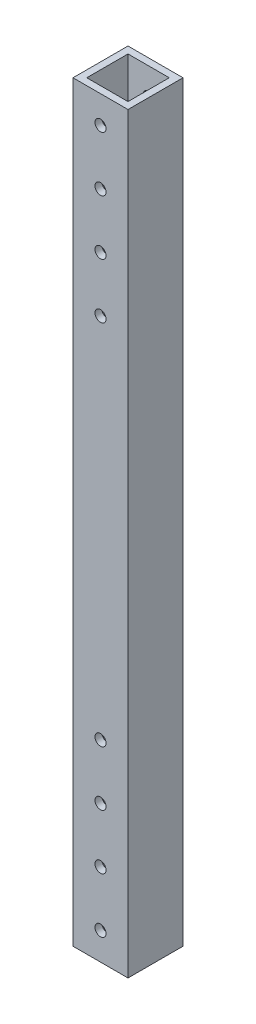
ISO-10303-21;
HEADER;
FILE_DESCRIPTION(('STEP AP214'),'2;1');
FILE_NAME('part.step','',(''),(''),'','','');
FILE_SCHEMA(('AUTOMOTIVE_DESIGN { 1 0 10303 214 1 1 1 1 }'));
ENDSEC;
DATA;
#1=APPLICATION_CONTEXT('core data for automotive mechanical design processes');
#2=APPLICATION_PROTOCOL_DEFINITION('international standard','automotive_design',2000,#1);
#3=PRODUCT_CONTEXT('',#1,'mechanical');
#4=PRODUCT('Part','Part','',(#3));
#5=PRODUCT_RELATED_PRODUCT_CATEGORY('part','',(#4));
#6=PRODUCT_DEFINITION_FORMATION('','',#4);
#7=PRODUCT_DEFINITION_CONTEXT('part definition',#1,'design');
#8=PRODUCT_DEFINITION('design','',#6,#7);
#9=PRODUCT_DEFINITION_SHAPE('','',#8);
#10=(LENGTH_UNIT() NAMED_UNIT(*) SI_UNIT(.MILLI.,.METRE.));
#11=(NAMED_UNIT(*) PLANE_ANGLE_UNIT() SI_UNIT($,.RADIAN.));
#12=(NAMED_UNIT(*) SI_UNIT($,.STERADIAN.) SOLID_ANGLE_UNIT());
#13=UNCERTAINTY_MEASURE_WITH_UNIT(LENGTH_MEASURE(1.E-05),#10,'distance_accuracy_value','');
#14=(GEOMETRIC_REPRESENTATION_CONTEXT(3) GLOBAL_UNCERTAINTY_ASSIGNED_CONTEXT((#13)) GLOBAL_UNIT_ASSIGNED_CONTEXT((#10,
#11,#12)) REPRESENTATION_CONTEXT('',''));
#15=CARTESIAN_POINT('',(0.,0.,0.));
#16=DIRECTION('',(0.,0.,1.));
#17=DIRECTION('',(1.,0.,0.));
#18=AXIS2_PLACEMENT_3D('',#15,#16,#17);
#19=CARTESIAN_POINT('',(-12.7,347.345,-12.7));
#20=DIRECTION('',(0.,0.,1.));
#21=DIRECTION('',(1.,0.,0.));
#22=AXIS2_PLACEMENT_3D('',#19,#20,#21);
#23=PLANE('',#22);
#24=CARTESIAN_POINT('',(0.,12.7,-12.7));
#25=DIRECTION('',(0.,0.,1.));
#26=DIRECTION('',(1.,0.,0.));
#27=AXIS2_PLACEMENT_3D('',#24,#25,#26);
#28=CIRCLE('',#27,2.5527);
#29=CARTESIAN_POINT('',(2.55270000000001,12.7,-12.7));
#30=VERTEX_POINT('',#29);
#31=EDGE_CURVE('E187',#30,#30,#28,.T.);
#32=ORIENTED_EDGE('',*,*,#31,.T.);
#33=EDGE_LOOP('',(#32));
#34=FACE_BOUND('',#33,.T.);
#35=CARTESIAN_POINT('',(0.,38.1,-12.7));
#36=DIRECTION('',(0.,0.,1.));
#37=DIRECTION('',(1.,0.,0.));
#38=AXIS2_PLACEMENT_3D('',#35,#36,#37);
#39=CIRCLE('',#38,2.5527);
#40=CARTESIAN_POINT('',(2.55270000000001,38.1,-12.7));
#41=VERTEX_POINT('',#40);
#42=EDGE_CURVE('E183',#41,#41,#39,.T.);
#43=ORIENTED_EDGE('',*,*,#42,.T.);
#44=EDGE_LOOP('',(#43));
#45=FACE_BOUND('',#44,.T.);
#46=CARTESIAN_POINT('',(0.,63.5,-12.7));
#47=DIRECTION('',(0.,0.,1.));
#48=DIRECTION('',(1.,0.,0.));
#49=AXIS2_PLACEMENT_3D('',#46,#47,#48);
#50=CIRCLE('',#49,2.5527);
#51=CARTESIAN_POINT('',(2.55270000000001,63.5,-12.7));
#52=VERTEX_POINT('',#51);
#53=EDGE_CURVE('E178',#52,#52,#50,.T.);
#54=ORIENTED_EDGE('',*,*,#53,.T.);
#55=EDGE_LOOP('',(#54));
#56=FACE_BOUND('',#55,.T.);
#57=CARTESIAN_POINT('',(0.,334.645,-12.7));
#58=DIRECTION('',(0.,0.,1.));
#59=DIRECTION('',(1.,0.,0.));
#60=AXIS2_PLACEMENT_3D('',#57,#58,#59);
#61=CIRCLE('',#60,2.5527);
#62=CARTESIAN_POINT('',(2.55270000000001,334.645,-12.7));
#63=VERTEX_POINT('',#62);
#64=EDGE_CURVE('E173',#63,#63,#61,.T.);
#65=ORIENTED_EDGE('',*,*,#64,.T.);
#66=EDGE_LOOP('',(#65));
#67=FACE_BOUND('',#66,.T.);
#68=CARTESIAN_POINT('',(0.,309.245,-12.7));
#69=DIRECTION('',(0.,0.,1.));
#70=DIRECTION('',(1.,0.,0.));
#71=AXIS2_PLACEMENT_3D('',#68,#69,#70);
#72=CIRCLE('',#71,2.5527);
#73=CARTESIAN_POINT('',(2.55270000000001,309.245,-12.7));
#74=VERTEX_POINT('',#73);
#75=EDGE_CURVE('E168',#74,#74,#72,.T.);
#76=ORIENTED_EDGE('',*,*,#75,.T.);
#77=EDGE_LOOP('',(#76));
#78=FACE_BOUND('',#77,.T.);
#79=CARTESIAN_POINT('',(0.,283.845,-12.7));
#80=DIRECTION('',(0.,0.,1.));
#81=DIRECTION('',(1.,0.,0.));
#82=AXIS2_PLACEMENT_3D('',#79,#80,#81);
#83=CIRCLE('',#82,2.5527);
#84=CARTESIAN_POINT('',(2.55270000000001,283.845,-12.7));
#85=VERTEX_POINT('',#84);
#86=EDGE_CURVE('E247',#85,#85,#83,.T.);
#87=ORIENTED_EDGE('',*,*,#86,.T.);
#88=EDGE_LOOP('',(#87));
#89=FACE_BOUND('',#88,.T.);
#90=DIRECTION('',(-1.,0.,0.));
#91=VECTOR('',#90,1.);
#92=CARTESIAN_POINT('',(-12.7,0.,-12.7));
#93=LINE('',#92,#91);
#94=CARTESIAN_POINT('',(12.7,0.,-12.7));
#95=VERTEX_POINT('',#94);
#96=CARTESIAN_POINT('',(-12.7,0.,-12.7));
#97=VERTEX_POINT('',#96);
#98=EDGE_CURVE('E152',#95,#97,#93,.T.);
#99=ORIENTED_EDGE('',*,*,#98,.T.);
#100=DIRECTION('',(0.,-1.,0.));
#101=VECTOR('',#100,1.);
#102=CARTESIAN_POINT('',(-12.7,347.345,-12.7));
#103=LINE('',#102,#101);
#104=CARTESIAN_POINT('',(-12.7,347.345,-12.7));
#105=VERTEX_POINT('',#104);
#106=EDGE_CURVE('E42',#105,#97,#103,.T.);
#107=ORIENTED_EDGE('',*,*,#106,.F.);
#108=DIRECTION('',(-1.,0.,0.));
#109=VECTOR('',#108,1.);
#110=CARTESIAN_POINT('',(-12.7,347.345,-12.7));
#111=LINE('',#110,#109);
#112=CARTESIAN_POINT('',(12.7,347.345,-12.7));
#113=VERTEX_POINT('',#112);
#114=EDGE_CURVE('E142',#113,#105,#111,.T.);
#115=ORIENTED_EDGE('',*,*,#114,.F.);
#116=DIRECTION('',(0.,-1.,0.));
#117=VECTOR('',#116,1.);
#118=CARTESIAN_POINT('',(12.7,347.345,-12.7));
#119=LINE('',#118,#117);
#120=EDGE_CURVE('E11',#113,#95,#119,.T.);
#121=ORIENTED_EDGE('',*,*,#120,.T.);
#122=EDGE_LOOP('',(#99,#107,#115,#121));
#123=FACE_BOUND('',#122,.T.);
#124=CARTESIAN_POINT('',(-1.67293712216576E-06,258.445000000046,-12.7));
#125=DIRECTION('',(0.,0.,1.));
#126=DIRECTION('',(1.,0.,0.));
#127=AXIS2_PLACEMENT_3D('',#124,#125,#126);
#128=CIRCLE('',#127,2.55269999999999);
#129=CARTESIAN_POINT('',(2.55269832706287,258.445000000046,-12.7));
#130=VERTEX_POINT('',#129);
#131=EDGE_CURVE('E191',#130,#130,#128,.F.);
#132=ORIENTED_EDGE('',*,*,#131,.F.);
#133=EDGE_LOOP('',(#132));
#134=FACE_BOUND('',#133,.T.);
#135=CARTESIAN_POINT('',(-1.67293734421037E-06,88.9000000000457,-12.7));
#136=DIRECTION('',(0.,0.,1.));
#137=DIRECTION('',(1.,0.,0.));
#138=AXIS2_PLACEMENT_3D('',#135,#136,#137);
#139=CIRCLE('',#138,2.55269999999999);
#140=CARTESIAN_POINT('',(2.55269832706265,88.9000000000457,-12.7));
#141=VERTEX_POINT('',#140);
#142=EDGE_CURVE('E384',#141,#141,#139,.F.);
#143=ORIENTED_EDGE('',*,*,#142,.F.);
#144=EDGE_LOOP('',(#143));
#145=FACE_BOUND('',#144,.T.);
#146=ADVANCED_FACE('F33',(#34,#45,#56,#67,#78,#89,#123,#134,#145),#23,.F.);
#147=CARTESIAN_POINT('',(0.,347.345,0.));
#148=DIRECTION('',(0.,1.,0.));
#149=DIRECTION('',(0.,0.,1.));
#150=AXIS2_PLACEMENT_3D('',#147,#148,#149);
#151=PLANE('',#150);
#152=DIRECTION('',(0.,0.,-1.));
#153=VECTOR('',#152,1.);
#154=CARTESIAN_POINT('',(12.7,347.345,-12.7));
#155=LINE('',#154,#153);
#156=CARTESIAN_POINT('',(12.7,347.345,12.7));
#157=VERTEX_POINT('',#156);
#158=EDGE_CURVE('E139',#157,#113,#155,.T.);
#159=ORIENTED_EDGE('',*,*,#158,.T.);
#160=ORIENTED_EDGE('',*,*,#114,.T.);
#161=DIRECTION('',(0.,0.,1.));
#162=VECTOR('',#161,1.);
#163=CARTESIAN_POINT('',(-12.7,347.345,-12.7));
#164=LINE('',#163,#162);
#165=CARTESIAN_POINT('',(-12.7,347.345,12.7));
#166=VERTEX_POINT('',#165);
#167=EDGE_CURVE('E145',#105,#166,#164,.T.);
#168=ORIENTED_EDGE('',*,*,#167,.T.);
#169=DIRECTION('',(1.,0.,0.));
#170=VECTOR('',#169,1.);
#171=CARTESIAN_POINT('',(-12.7,347.345,12.7));
#172=LINE('',#171,#170);
#173=EDGE_CURVE('E147',#166,#157,#172,.T.);
#174=ORIENTED_EDGE('',*,*,#173,.T.);
#175=EDGE_LOOP('',(#159,#160,#168,#174));
#176=FACE_BOUND('',#175,.T.);
#177=DIRECTION('',(-1.,0.,0.));
#178=VECTOR('',#177,1.);
#179=CARTESIAN_POINT('',(-9.525,347.345,-9.525));
#180=LINE('',#179,#178);
#181=CARTESIAN_POINT('',(9.52499999999999,347.345,-9.525));
#182=VERTEX_POINT('',#181);
#183=CARTESIAN_POINT('',(-9.525,347.345,-9.525));
#184=VERTEX_POINT('',#183);
#185=EDGE_CURVE('E108',#182,#184,#180,.T.);
#186=ORIENTED_EDGE('',*,*,#185,.F.);
#187=DIRECTION('',(0.,0.,-1.));
#188=VECTOR('',#187,1.);
#189=CARTESIAN_POINT('',(9.52499999999999,347.345,-9.525));
#190=LINE('',#189,#188);
#191=CARTESIAN_POINT('',(9.52499999999999,347.345,9.525));
#192=VERTEX_POINT('',#191);
#193=EDGE_CURVE('E100',#192,#182,#190,.T.);
#194=ORIENTED_EDGE('',*,*,#193,.F.);
#195=DIRECTION('',(1.,0.,0.));
#196=VECTOR('',#195,1.);
#197=CARTESIAN_POINT('',(-9.525,347.345,9.525));
#198=LINE('',#197,#196);
#199=CARTESIAN_POINT('',(-9.525,347.345,9.525));
#200=VERTEX_POINT('',#199);
#201=EDGE_CURVE('E123',#200,#192,#198,.T.);
#202=ORIENTED_EDGE('',*,*,#201,.F.);
#203=DIRECTION('',(0.,0.,1.));
#204=VECTOR('',#203,1.);
#205=CARTESIAN_POINT('',(-9.525,347.345,-9.525));
#206=LINE('',#205,#204);
#207=EDGE_CURVE('E121',#184,#200,#206,.T.);
#208=ORIENTED_EDGE('',*,*,#207,.F.);
#209=EDGE_LOOP('',(#186,#194,#202,#208));
#210=FACE_BOUND('',#209,.T.);
#211=ADVANCED_FACE('F120',(#176,#210),#151,.T.);
#212=CARTESIAN_POINT('',(0.,0.,0.));
#213=DIRECTION('',(0.,1.,0.));
#214=DIRECTION('',(0.,0.,1.));
#215=AXIS2_PLACEMENT_3D('',#212,#213,#214);
#216=PLANE('',#215);
#217=DIRECTION('',(0.,0.,-1.));
#218=VECTOR('',#217,1.);
#219=CARTESIAN_POINT('',(12.7,0.,-12.7));
#220=LINE('',#219,#218);
#221=CARTESIAN_POINT('',(12.7,0.,12.7));
#222=VERTEX_POINT('',#221);
#223=EDGE_CURVE('E116',#222,#95,#220,.T.);
#224=ORIENTED_EDGE('',*,*,#223,.F.);
#225=DIRECTION('',(1.,0.,0.));
#226=VECTOR('',#225,1.);
#227=CARTESIAN_POINT('',(-12.7,0.,12.7));
#228=LINE('',#227,#226);
#229=CARTESIAN_POINT('',(-12.7,0.,12.7));
#230=VERTEX_POINT('',#229);
#231=EDGE_CURVE('E143',#230,#222,#228,.T.);
#232=ORIENTED_EDGE('',*,*,#231,.F.);
#233=DIRECTION('',(0.,0.,1.));
#234=VECTOR('',#233,1.);
#235=CARTESIAN_POINT('',(-12.7,0.,-12.7));
#236=LINE('',#235,#234);
#237=EDGE_CURVE('E154',#97,#230,#236,.T.);
#238=ORIENTED_EDGE('',*,*,#237,.F.);
#239=ORIENTED_EDGE('',*,*,#98,.F.);
#240=EDGE_LOOP('',(#224,#232,#238,#239));
#241=FACE_BOUND('',#240,.T.);
#242=DIRECTION('',(0.,0.,-1.));
#243=VECTOR('',#242,1.);
#244=CARTESIAN_POINT('',(9.52499999999999,0.,-9.525));
#245=LINE('',#244,#243);
#246=CARTESIAN_POINT('',(9.52499999999999,0.,9.525));
#247=VERTEX_POINT('',#246);
#248=CARTESIAN_POINT('',(9.52499999999999,0.,-9.525));
#249=VERTEX_POINT('',#248);
#250=EDGE_CURVE('E58',#247,#249,#245,.T.);
#251=ORIENTED_EDGE('',*,*,#250,.T.);
#252=DIRECTION('',(-1.,0.,0.));
#253=VECTOR('',#252,1.);
#254=CARTESIAN_POINT('',(-9.525,0.,-9.525));
#255=LINE('',#254,#253);
#256=CARTESIAN_POINT('',(-9.525,0.,-9.525));
#257=VERTEX_POINT('',#256);
#258=EDGE_CURVE('E115',#249,#257,#255,.T.);
#259=ORIENTED_EDGE('',*,*,#258,.T.);
#260=DIRECTION('',(0.,0.,1.));
#261=VECTOR('',#260,1.);
#262=CARTESIAN_POINT('',(-9.525,0.,-9.525));
#263=LINE('',#262,#261);
#264=CARTESIAN_POINT('',(-9.525,0.,9.525));
#265=VERTEX_POINT('',#264);
#266=EDGE_CURVE('E131',#257,#265,#263,.T.);
#267=ORIENTED_EDGE('',*,*,#266,.T.);
#268=DIRECTION('',(1.,0.,0.));
#269=VECTOR('',#268,1.);
#270=CARTESIAN_POINT('',(-9.525,0.,9.525));
#271=LINE('',#270,#269);
#272=EDGE_CURVE('E109',#265,#247,#271,.T.);
#273=ORIENTED_EDGE('',*,*,#272,.T.);
#274=EDGE_LOOP('',(#251,#259,#267,#273));
#275=FACE_BOUND('',#274,.T.);
#276=ADVANCED_FACE('F281',(#241,#275),#216,.F.);
#277=CARTESIAN_POINT('',(12.7,347.345,-12.7));
#278=DIRECTION('',(-1.,0.,0.));
#279=DIRECTION('',(0.,0.,1.));
#280=AXIS2_PLACEMENT_3D('',#277,#278,#279);
#281=PLANE('',#280);
#282=ORIENTED_EDGE('',*,*,#223,.T.);
#283=ORIENTED_EDGE('',*,*,#120,.F.);
#284=ORIENTED_EDGE('',*,*,#158,.F.);
#285=DIRECTION('',(0.,-1.,0.));
#286=VECTOR('',#285,1.);
#287=CARTESIAN_POINT('',(12.7,347.345,12.7));
#288=LINE('',#287,#286);
#289=EDGE_CURVE('E149',#157,#222,#288,.T.);
#290=ORIENTED_EDGE('',*,*,#289,.T.);
#291=EDGE_LOOP('',(#282,#283,#284,#290));
#292=FACE_BOUND('',#291,.T.);
#293=ADVANCED_FACE('F35',(#292),#281,.F.);
#294=CARTESIAN_POINT('',(-12.7,347.345,-12.7));
#295=DIRECTION('',(1.,0.,0.));
#296=DIRECTION('',(0.,0.,-1.));
#297=AXIS2_PLACEMENT_3D('',#294,#295,#296);
#298=PLANE('',#297);
#299=ORIENTED_EDGE('',*,*,#237,.T.);
#300=DIRECTION('',(0.,-1.,0.));
#301=VECTOR('',#300,1.);
#302=CARTESIAN_POINT('',(-12.7,347.345,12.7));
#303=LINE('',#302,#301);
#304=EDGE_CURVE('E159',#166,#230,#303,.T.);
#305=ORIENTED_EDGE('',*,*,#304,.F.);
#306=ORIENTED_EDGE('',*,*,#167,.F.);
#307=ORIENTED_EDGE('',*,*,#106,.T.);
#308=EDGE_LOOP('',(#299,#305,#306,#307));
#309=FACE_BOUND('',#308,.T.);
#310=ADVANCED_FACE('F286',(#309),#298,.F.);
#311=CARTESIAN_POINT('',(-12.7,347.345,12.7));
#312=DIRECTION('',(0.,0.,-1.));
#313=DIRECTION('',(-1.,0.,0.));
#314=AXIS2_PLACEMENT_3D('',#311,#312,#313);
#315=PLANE('',#314);
#316=CARTESIAN_POINT('',(-1.67293734421037E-06,88.9000000000457,12.7));
#317=DIRECTION('',(0.,0.,-1.));
#318=DIRECTION('',(-1.,0.,0.));
#319=AXIS2_PLACEMENT_3D('',#316,#317,#318);
#320=CIRCLE('',#319,2.55269999999999);
#321=CARTESIAN_POINT('',(-2.55270167293734,88.9000000000457,12.7));
#322=VERTEX_POINT('',#321);
#323=EDGE_CURVE('E198',#322,#322,#320,.T.);
#324=ORIENTED_EDGE('',*,*,#323,.T.);
#325=EDGE_LOOP('',(#324));
#326=FACE_BOUND('',#325,.T.);
#327=CARTESIAN_POINT('',(-1.67293712216576E-06,258.445000000046,12.7));
#328=DIRECTION('',(0.,0.,-1.));
#329=DIRECTION('',(-1.,0.,0.));
#330=AXIS2_PLACEMENT_3D('',#327,#328,#329);
#331=CIRCLE('',#330,2.55269999999999);
#332=CARTESIAN_POINT('',(-2.55270167293711,258.445000000046,12.7));
#333=VERTEX_POINT('',#332);
#334=EDGE_CURVE('E195',#333,#333,#331,.T.);
#335=ORIENTED_EDGE('',*,*,#334,.T.);
#336=EDGE_LOOP('',(#335));
#337=FACE_BOUND('',#336,.T.);
#338=CARTESIAN_POINT('',(0.,12.7,12.7));
#339=DIRECTION('',(0.,0.,1.));
#340=DIRECTION('',(1.,0.,0.));
#341=AXIS2_PLACEMENT_3D('',#338,#339,#340);
#342=CIRCLE('',#341,2.55269999999999);
#343=CARTESIAN_POINT('',(2.55270000000001,12.7,12.7));
#344=VERTEX_POINT('',#343);
#345=EDGE_CURVE('E209',#344,#344,#342,.T.);
#346=ORIENTED_EDGE('',*,*,#345,.F.);
#347=EDGE_LOOP('',(#346));
#348=FACE_BOUND('',#347,.T.);
#349=CARTESIAN_POINT('',(0.,38.1,12.7));
#350=DIRECTION('',(0.,0.,1.));
#351=DIRECTION('',(1.,0.,0.));
#352=AXIS2_PLACEMENT_3D('',#349,#350,#351);
#353=CIRCLE('',#352,2.55269999999999);
#354=CARTESIAN_POINT('',(2.5527,38.1,12.7));
#355=VERTEX_POINT('',#354);
#356=EDGE_CURVE('E216',#355,#355,#353,.T.);
#357=ORIENTED_EDGE('',*,*,#356,.F.);
#358=EDGE_LOOP('',(#357));
#359=FACE_BOUND('',#358,.T.);
#360=CARTESIAN_POINT('',(0.,63.5,12.7));
#361=DIRECTION('',(0.,0.,1.));
#362=DIRECTION('',(1.,0.,0.));
#363=AXIS2_PLACEMENT_3D('',#360,#361,#362);
#364=CIRCLE('',#363,2.55269999999999);
#365=CARTESIAN_POINT('',(2.5527,63.5,12.7));
#366=VERTEX_POINT('',#365);
#367=EDGE_CURVE('E223',#366,#366,#364,.T.);
#368=ORIENTED_EDGE('',*,*,#367,.F.);
#369=EDGE_LOOP('',(#368));
#370=FACE_BOUND('',#369,.T.);
#371=CARTESIAN_POINT('',(0.,334.645,12.7));
#372=DIRECTION('',(0.,0.,1.));
#373=DIRECTION('',(1.,0.,0.));
#374=AXIS2_PLACEMENT_3D('',#371,#372,#373);
#375=CIRCLE('',#374,2.55269999999999);
#376=CARTESIAN_POINT('',(2.5527,334.645,12.7));
#377=VERTEX_POINT('',#376);
#378=EDGE_CURVE('E230',#377,#377,#375,.T.);
#379=ORIENTED_EDGE('',*,*,#378,.F.);
#380=EDGE_LOOP('',(#379));
#381=FACE_BOUND('',#380,.T.);
#382=CARTESIAN_POINT('',(0.,309.245,12.7));
#383=DIRECTION('',(0.,0.,1.));
#384=DIRECTION('',(1.,0.,0.));
#385=AXIS2_PLACEMENT_3D('',#382,#383,#384);
#386=CIRCLE('',#385,2.55269999999999);
#387=CARTESIAN_POINT('',(2.5527,309.245,12.7));
#388=VERTEX_POINT('',#387);
#389=EDGE_CURVE('E237',#388,#388,#386,.T.);
#390=ORIENTED_EDGE('',*,*,#389,.F.);
#391=EDGE_LOOP('',(#390));
#392=FACE_BOUND('',#391,.T.);
#393=CARTESIAN_POINT('',(0.,283.845,12.7));
#394=DIRECTION('',(0.,0.,1.));
#395=DIRECTION('',(1.,0.,0.));
#396=AXIS2_PLACEMENT_3D('',#393,#394,#395);
#397=CIRCLE('',#396,2.55269999999999);
#398=CARTESIAN_POINT('',(2.5527,283.845,12.7));
#399=VERTEX_POINT('',#398);
#400=EDGE_CURVE('E244',#399,#399,#397,.T.);
#401=ORIENTED_EDGE('',*,*,#400,.F.);
#402=EDGE_LOOP('',(#401));
#403=FACE_BOUND('',#402,.T.);
#404=ORIENTED_EDGE('',*,*,#231,.T.);
#405=ORIENTED_EDGE('',*,*,#289,.F.);
#406=ORIENTED_EDGE('',*,*,#173,.F.);
#407=ORIENTED_EDGE('',*,*,#304,.T.);
#408=EDGE_LOOP('',(#404,#405,#406,#407));
#409=FACE_BOUND('',#408,.T.);
#410=ADVANCED_FACE('F271',(#326,#337,#348,#359,#370,#381,#392,#403,#409),#315,.F.);
#411=CARTESIAN_POINT('',(9.52499999999999,347.345,-9.525));
#412=DIRECTION('',(-1.,0.,0.));
#413=DIRECTION('',(0.,0.,1.));
#414=AXIS2_PLACEMENT_3D('',#411,#412,#413);
#415=PLANE('',#414);
#416=ORIENTED_EDGE('',*,*,#250,.F.);
#417=DIRECTION('',(0.,-1.,0.));
#418=VECTOR('',#417,1.);
#419=CARTESIAN_POINT('',(9.52499999999999,347.345,9.525));
#420=LINE('',#419,#418);
#421=EDGE_CURVE('E104',#192,#247,#420,.T.);
#422=ORIENTED_EDGE('',*,*,#421,.F.);
#423=ORIENTED_EDGE('',*,*,#193,.T.);
#424=DIRECTION('',(0.,-1.,0.));
#425=VECTOR('',#424,1.);
#426=CARTESIAN_POINT('',(9.52499999999999,347.345,-9.525));
#427=LINE('',#426,#425);
#428=EDGE_CURVE('E103',#182,#249,#427,.T.);
#429=ORIENTED_EDGE('',*,*,#428,.T.);
#430=EDGE_LOOP('',(#416,#422,#423,#429));
#431=FACE_BOUND('',#430,.T.);
#432=ADVANCED_FACE('F102',(#431),#415,.T.);
#433=CARTESIAN_POINT('',(-9.525,347.345,-9.525));
#434=DIRECTION('',(0.,0.,1.));
#435=DIRECTION('',(1.,0.,0.));
#436=AXIS2_PLACEMENT_3D('',#433,#434,#435);
#437=PLANE('',#436);
#438=CARTESIAN_POINT('',(-1.67293734421037E-06,88.9000000000457,-9.525));
#439=DIRECTION('',(0.,0.,1.));
#440=DIRECTION('',(1.,0.,0.));
#441=AXIS2_PLACEMENT_3D('',#438,#439,#440);
#442=CIRCLE('',#441,2.55269999999999);
#443=CARTESIAN_POINT('',(2.55269832706265,88.9000000000457,-9.525));
#444=VERTEX_POINT('',#443);
#445=EDGE_CURVE('E203',#444,#444,#442,.T.);
#446=ORIENTED_EDGE('',*,*,#445,.F.);
#447=EDGE_LOOP('',(#446));
#448=FACE_BOUND('',#447,.T.);
#449=CARTESIAN_POINT('',(-1.67293712216576E-06,258.445000000046,-9.525));
#450=DIRECTION('',(0.,0.,1.));
#451=DIRECTION('',(1.,0.,0.));
#452=AXIS2_PLACEMENT_3D('',#449,#450,#451);
#453=CIRCLE('',#452,2.55269999999999);
#454=CARTESIAN_POINT('',(2.55269832706287,258.445000000046,-9.525));
#455=VERTEX_POINT('',#454);
#456=EDGE_CURVE('E190',#455,#455,#453,.T.);
#457=ORIENTED_EDGE('',*,*,#456,.F.);
#458=EDGE_LOOP('',(#457));
#459=FACE_BOUND('',#458,.T.);
#460=CARTESIAN_POINT('',(0.,12.7,-9.525));
#461=DIRECTION('',(0.,0.,1.));
#462=DIRECTION('',(1.,0.,0.));
#463=AXIS2_PLACEMENT_3D('',#460,#461,#462);
#464=CIRCLE('',#463,2.55269999999999);
#465=CARTESIAN_POINT('',(2.55270000000001,12.7,-9.525));
#466=VERTEX_POINT('',#465);
#467=EDGE_CURVE('E186',#466,#466,#464,.T.);
#468=ORIENTED_EDGE('',*,*,#467,.F.);
#469=EDGE_LOOP('',(#468));
#470=FACE_BOUND('',#469,.T.);
#471=CARTESIAN_POINT('',(0.,38.1,-9.525));
#472=DIRECTION('',(0.,0.,1.));
#473=DIRECTION('',(1.,0.,0.));
#474=AXIS2_PLACEMENT_3D('',#471,#472,#473);
#475=CIRCLE('',#474,2.55269999999999);
#476=CARTESIAN_POINT('',(2.55270000000001,38.1,-9.525));
#477=VERTEX_POINT('',#476);
#478=EDGE_CURVE('E182',#477,#477,#475,.T.);
#479=ORIENTED_EDGE('',*,*,#478,.F.);
#480=EDGE_LOOP('',(#479));
#481=FACE_BOUND('',#480,.T.);
#482=CARTESIAN_POINT('',(0.,63.5,-9.525));
#483=DIRECTION('',(0.,0.,1.));
#484=DIRECTION('',(1.,0.,0.));
#485=AXIS2_PLACEMENT_3D('',#482,#483,#484);
#486=CIRCLE('',#485,2.55269999999999);
#487=CARTESIAN_POINT('',(2.5527,63.5,-9.525));
#488=VERTEX_POINT('',#487);
#489=EDGE_CURVE('E177',#488,#488,#486,.T.);
#490=ORIENTED_EDGE('',*,*,#489,.F.);
#491=EDGE_LOOP('',(#490));
#492=FACE_BOUND('',#491,.T.);
#493=CARTESIAN_POINT('',(0.,334.645,-9.525));
#494=DIRECTION('',(0.,0.,1.));
#495=DIRECTION('',(1.,0.,0.));
#496=AXIS2_PLACEMENT_3D('',#493,#494,#495);
#497=CIRCLE('',#496,2.55269999999999);
#498=CARTESIAN_POINT('',(2.55270000000001,334.645,-9.525));
#499=VERTEX_POINT('',#498);
#500=EDGE_CURVE('E172',#499,#499,#497,.T.);
#501=ORIENTED_EDGE('',*,*,#500,.F.);
#502=EDGE_LOOP('',(#501));
#503=FACE_BOUND('',#502,.T.);
#504=CARTESIAN_POINT('',(0.,309.245,-9.525));
#505=DIRECTION('',(0.,0.,1.));
#506=DIRECTION('',(1.,0.,0.));
#507=AXIS2_PLACEMENT_3D('',#504,#505,#506);
#508=CIRCLE('',#507,2.55269999999999);
#509=CARTESIAN_POINT('',(2.55270000000001,309.245,-9.525));
#510=VERTEX_POINT('',#509);
#511=EDGE_CURVE('E167',#510,#510,#508,.T.);
#512=ORIENTED_EDGE('',*,*,#511,.F.);
#513=EDGE_LOOP('',(#512));
#514=FACE_BOUND('',#513,.T.);
#515=CARTESIAN_POINT('',(0.,283.845,-9.525));
#516=DIRECTION('',(0.,0.,1.));
#517=DIRECTION('',(1.,0.,0.));
#518=AXIS2_PLACEMENT_3D('',#515,#516,#517);
#519=CIRCLE('',#518,2.55269999999999);
#520=CARTESIAN_POINT('',(2.5527,283.845,-9.525));
#521=VERTEX_POINT('',#520);
#522=EDGE_CURVE('E129',#521,#521,#519,.T.);
#523=ORIENTED_EDGE('',*,*,#522,.F.);
#524=EDGE_LOOP('',(#523));
#525=FACE_BOUND('',#524,.T.);
#526=ORIENTED_EDGE('',*,*,#258,.F.);
#527=ORIENTED_EDGE('',*,*,#428,.F.);
#528=ORIENTED_EDGE('',*,*,#185,.T.);
#529=DIRECTION('',(0.,-1.,0.));
#530=VECTOR('',#529,1.);
#531=CARTESIAN_POINT('',(-9.525,347.345,-9.525));
#532=LINE('',#531,#530);
#533=EDGE_CURVE('E117',#184,#257,#532,.T.);
#534=ORIENTED_EDGE('',*,*,#533,.T.);
#535=EDGE_LOOP('',(#526,#527,#528,#534));
#536=FACE_BOUND('',#535,.T.);
#537=ADVANCED_FACE('F112',(#448,#459,#470,#481,#492,#503,#514,#525,#536),#437,.T.);
#538=CARTESIAN_POINT('',(-9.525,347.345,-9.525));
#539=DIRECTION('',(1.,0.,0.));
#540=DIRECTION('',(0.,0.,-1.));
#541=AXIS2_PLACEMENT_3D('',#538,#539,#540);
#542=PLANE('',#541);
#543=ORIENTED_EDGE('',*,*,#266,.F.);
#544=ORIENTED_EDGE('',*,*,#533,.F.);
#545=ORIENTED_EDGE('',*,*,#207,.T.);
#546=DIRECTION('',(0.,-1.,0.));
#547=VECTOR('',#546,1.);
#548=CARTESIAN_POINT('',(-9.525,347.345,9.525));
#549=LINE('',#548,#547);
#550=EDGE_CURVE('E50',#200,#265,#549,.T.);
#551=ORIENTED_EDGE('',*,*,#550,.T.);
#552=EDGE_LOOP('',(#543,#544,#545,#551));
#553=FACE_BOUND('',#552,.T.);
#554=ADVANCED_FACE('F259',(#553),#542,.T.);
#555=CARTESIAN_POINT('',(-9.525,347.345,9.525));
#556=DIRECTION('',(0.,0.,-1.));
#557=DIRECTION('',(-1.,0.,0.));
#558=AXIS2_PLACEMENT_3D('',#555,#556,#557);
#559=PLANE('',#558);
#560=CARTESIAN_POINT('',(-1.67293734421037E-06,88.9000000000457,9.525));
#561=DIRECTION('',(0.,0.,-1.));
#562=DIRECTION('',(-1.,0.,0.));
#563=AXIS2_PLACEMENT_3D('',#560,#561,#562);
#564=CIRCLE('',#563,2.55269999999999);
#565=CARTESIAN_POINT('',(-2.55270167293734,88.9000000000457,9.525));
#566=VERTEX_POINT('',#565);
#567=EDGE_CURVE('E37',#566,#566,#564,.T.);
#568=ORIENTED_EDGE('',*,*,#567,.F.);
#569=EDGE_LOOP('',(#568));
#570=FACE_BOUND('',#569,.T.);
#571=CARTESIAN_POINT('',(-1.67293712216576E-06,258.445000000046,9.525));
#572=DIRECTION('',(0.,0.,-1.));
#573=DIRECTION('',(-1.,0.,0.));
#574=AXIS2_PLACEMENT_3D('',#571,#572,#573);
#575=CIRCLE('',#574,2.55269999999999);
#576=CARTESIAN_POINT('',(-2.55270167293711,258.445000000046,9.525));
#577=VERTEX_POINT('',#576);
#578=EDGE_CURVE('E188',#577,#577,#575,.T.);
#579=ORIENTED_EDGE('',*,*,#578,.F.);
#580=EDGE_LOOP('',(#579));
#581=FACE_BOUND('',#580,.T.);
#582=CARTESIAN_POINT('',(0.,12.7,9.525));
#583=DIRECTION('',(0.,0.,-1.));
#584=DIRECTION('',(-1.,0.,0.));
#585=AXIS2_PLACEMENT_3D('',#582,#583,#584);
#586=CIRCLE('',#585,2.55269999999999);
#587=CARTESIAN_POINT('',(-2.55269999999997,12.7,9.525));
#588=VERTEX_POINT('',#587);
#589=EDGE_CURVE('E184',#588,#588,#586,.T.);
#590=ORIENTED_EDGE('',*,*,#589,.F.);
#591=EDGE_LOOP('',(#590));
#592=FACE_BOUND('',#591,.T.);
#593=CARTESIAN_POINT('',(0.,38.1,9.525));
#594=DIRECTION('',(0.,0.,-1.));
#595=DIRECTION('',(-1.,0.,0.));
#596=AXIS2_PLACEMENT_3D('',#593,#594,#595);
#597=CIRCLE('',#596,2.55269999999999);
#598=CARTESIAN_POINT('',(-2.55269999999998,38.1,9.525));
#599=VERTEX_POINT('',#598);
#600=EDGE_CURVE('E179',#599,#599,#597,.T.);
#601=ORIENTED_EDGE('',*,*,#600,.F.);
#602=EDGE_LOOP('',(#601));
#603=FACE_BOUND('',#602,.T.);
#604=CARTESIAN_POINT('',(0.,63.5,9.525));
#605=DIRECTION('',(0.,0.,-1.));
#606=DIRECTION('',(-1.,0.,0.));
#607=AXIS2_PLACEMENT_3D('',#604,#605,#606);
#608=CIRCLE('',#607,2.55269999999999);
#609=CARTESIAN_POINT('',(-2.55269999999998,63.5,9.525));
#610=VERTEX_POINT('',#609);
#611=EDGE_CURVE('E174',#610,#610,#608,.T.);
#612=ORIENTED_EDGE('',*,*,#611,.F.);
#613=EDGE_LOOP('',(#612));
#614=FACE_BOUND('',#613,.T.);
#615=CARTESIAN_POINT('',(0.,334.645,9.525));
#616=DIRECTION('',(0.,0.,-1.));
#617=DIRECTION('',(-1.,0.,0.));
#618=AXIS2_PLACEMENT_3D('',#615,#616,#617);
#619=CIRCLE('',#618,2.55269999999999);
#620=CARTESIAN_POINT('',(-2.55269999999998,334.645,9.525));
#621=VERTEX_POINT('',#620);
#622=EDGE_CURVE('E169',#621,#621,#619,.T.);
#623=ORIENTED_EDGE('',*,*,#622,.F.);
#624=EDGE_LOOP('',(#623));
#625=FACE_BOUND('',#624,.T.);
#626=CARTESIAN_POINT('',(0.,309.245,9.525));
#627=DIRECTION('',(0.,0.,-1.));
#628=DIRECTION('',(-1.,0.,0.));
#629=AXIS2_PLACEMENT_3D('',#626,#627,#628);
#630=CIRCLE('',#629,2.55269999999999);
#631=CARTESIAN_POINT('',(-2.55269999999998,309.245,9.525));
#632=VERTEX_POINT('',#631);
#633=EDGE_CURVE('E164',#632,#632,#630,.T.);
#634=ORIENTED_EDGE('',*,*,#633,.F.);
#635=EDGE_LOOP('',(#634));
#636=FACE_BOUND('',#635,.T.);
#637=CARTESIAN_POINT('',(0.,283.845,9.525));
#638=DIRECTION('',(0.,0.,-1.));
#639=DIRECTION('',(-1.,0.,0.));
#640=AXIS2_PLACEMENT_3D('',#637,#638,#639);
#641=CIRCLE('',#640,2.55269999999999);
#642=CARTESIAN_POINT('',(-2.55269999999998,283.845,9.525));
#643=VERTEX_POINT('',#642);
#644=EDGE_CURVE('E250',#643,#643,#641,.T.);
#645=ORIENTED_EDGE('',*,*,#644,.F.);
#646=EDGE_LOOP('',(#645));
#647=FACE_BOUND('',#646,.T.);
#648=ORIENTED_EDGE('',*,*,#272,.F.);
#649=ORIENTED_EDGE('',*,*,#550,.F.);
#650=ORIENTED_EDGE('',*,*,#201,.T.);
#651=ORIENTED_EDGE('',*,*,#421,.T.);
#652=EDGE_LOOP('',(#648,#649,#650,#651));
#653=FACE_BOUND('',#652,.T.);
#654=ADVANCED_FACE('F267',(#570,#581,#592,#603,#614,#625,#636,#647,#653),#559,.T.);
#655=CARTESIAN_POINT('',(0.,283.845,12.7));
#656=DIRECTION('',(0.,0.,1.));
#657=DIRECTION('',(1.,0.,0.));
#658=AXIS2_PLACEMENT_3D('',#655,#656,#657);
#659=CYLINDRICAL_SURFACE('',#658,2.55269999999999);
#660=ORIENTED_EDGE('',*,*,#644,.T.);
#661=EDGE_LOOP('',(#660));
#662=FACE_BOUND('',#661,.T.);
#663=ORIENTED_EDGE('',*,*,#400,.T.);
#664=EDGE_LOOP('',(#663));
#665=FACE_BOUND('',#664,.T.);
#666=ADVANCED_FACE('F302',(#662,#665),#659,.F.);
#667=ORIENTED_EDGE('',*,*,#522,.T.);
#668=EDGE_LOOP('',(#667));
#669=FACE_BOUND('',#668,.T.);
#670=ORIENTED_EDGE('',*,*,#86,.F.);
#671=EDGE_LOOP('',(#670));
#672=FACE_BOUND('',#671,.T.);
#673=ADVANCED_FACE('F255',(#669,#672),#659,.F.);
#674=CARTESIAN_POINT('',(0.,309.245,12.7));
#675=DIRECTION('',(0.,0.,1.));
#676=DIRECTION('',(1.,0.,0.));
#677=AXIS2_PLACEMENT_3D('',#674,#675,#676);
#678=CYLINDRICAL_SURFACE('',#677,2.55269999999999);
#679=ORIENTED_EDGE('',*,*,#633,.T.);
#680=EDGE_LOOP('',(#679));
#681=FACE_BOUND('',#680,.T.);
#682=ORIENTED_EDGE('',*,*,#389,.T.);
#683=EDGE_LOOP('',(#682));
#684=FACE_BOUND('',#683,.T.);
#685=ADVANCED_FACE('F314',(#681,#684),#678,.F.);
#686=ORIENTED_EDGE('',*,*,#511,.T.);
#687=EDGE_LOOP('',(#686));
#688=FACE_BOUND('',#687,.T.);
#689=ORIENTED_EDGE('',*,*,#75,.F.);
#690=EDGE_LOOP('',(#689));
#691=FACE_BOUND('',#690,.T.);
#692=ADVANCED_FACE('F317',(#688,#691),#678,.F.);
#693=CARTESIAN_POINT('',(0.,334.645,12.7));
#694=DIRECTION('',(0.,0.,1.));
#695=DIRECTION('',(1.,0.,0.));
#696=AXIS2_PLACEMENT_3D('',#693,#694,#695);
#697=CYLINDRICAL_SURFACE('',#696,2.55269999999999);
#698=ORIENTED_EDGE('',*,*,#622,.T.);
#699=EDGE_LOOP('',(#698));
#700=FACE_BOUND('',#699,.T.);
#701=ORIENTED_EDGE('',*,*,#378,.T.);
#702=EDGE_LOOP('',(#701));
#703=FACE_BOUND('',#702,.T.);
#704=ADVANCED_FACE('F319',(#700,#703),#697,.F.);
#705=ORIENTED_EDGE('',*,*,#500,.T.);
#706=EDGE_LOOP('',(#705));
#707=FACE_BOUND('',#706,.T.);
#708=ORIENTED_EDGE('',*,*,#64,.F.);
#709=EDGE_LOOP('',(#708));
#710=FACE_BOUND('',#709,.T.);
#711=ADVANCED_FACE('F322',(#707,#710),#697,.F.);
#712=CARTESIAN_POINT('',(0.,63.5,12.7));
#713=DIRECTION('',(0.,0.,1.));
#714=DIRECTION('',(1.,0.,0.));
#715=AXIS2_PLACEMENT_3D('',#712,#713,#714);
#716=CYLINDRICAL_SURFACE('',#715,2.55269999999999);
#717=ORIENTED_EDGE('',*,*,#611,.T.);
#718=EDGE_LOOP('',(#717));
#719=FACE_BOUND('',#718,.T.);
#720=ORIENTED_EDGE('',*,*,#367,.T.);
#721=EDGE_LOOP('',(#720));
#722=FACE_BOUND('',#721,.T.);
#723=ADVANCED_FACE('F324',(#719,#722),#716,.F.);
#724=ORIENTED_EDGE('',*,*,#489,.T.);
#725=EDGE_LOOP('',(#724));
#726=FACE_BOUND('',#725,.T.);
#727=ORIENTED_EDGE('',*,*,#53,.F.);
#728=EDGE_LOOP('',(#727));
#729=FACE_BOUND('',#728,.T.);
#730=ADVANCED_FACE('F327',(#726,#729),#716,.F.);
#731=CARTESIAN_POINT('',(0.,38.1,12.7));
#732=DIRECTION('',(0.,0.,1.));
#733=DIRECTION('',(1.,0.,0.));
#734=AXIS2_PLACEMENT_3D('',#731,#732,#733);
#735=CYLINDRICAL_SURFACE('',#734,2.55269999999999);
#736=ORIENTED_EDGE('',*,*,#600,.T.);
#737=EDGE_LOOP('',(#736));
#738=FACE_BOUND('',#737,.T.);
#739=ORIENTED_EDGE('',*,*,#356,.T.);
#740=EDGE_LOOP('',(#739));
#741=FACE_BOUND('',#740,.T.);
#742=ADVANCED_FACE('F329',(#738,#741),#735,.F.);
#743=ORIENTED_EDGE('',*,*,#478,.T.);
#744=EDGE_LOOP('',(#743));
#745=FACE_BOUND('',#744,.T.);
#746=ORIENTED_EDGE('',*,*,#42,.F.);
#747=EDGE_LOOP('',(#746));
#748=FACE_BOUND('',#747,.T.);
#749=ADVANCED_FACE('F332',(#745,#748),#735,.F.);
#750=CARTESIAN_POINT('',(0.,12.7,12.7));
#751=DIRECTION('',(0.,0.,1.));
#752=DIRECTION('',(1.,0.,0.));
#753=AXIS2_PLACEMENT_3D('',#750,#751,#752);
#754=CYLINDRICAL_SURFACE('',#753,2.55269999999999);
#755=ORIENTED_EDGE('',*,*,#589,.T.);
#756=EDGE_LOOP('',(#755));
#757=FACE_BOUND('',#756,.T.);
#758=ORIENTED_EDGE('',*,*,#345,.T.);
#759=EDGE_LOOP('',(#758));
#760=FACE_BOUND('',#759,.T.);
#761=ADVANCED_FACE('F334',(#757,#760),#754,.F.);
#762=ORIENTED_EDGE('',*,*,#467,.T.);
#763=EDGE_LOOP('',(#762));
#764=FACE_BOUND('',#763,.T.);
#765=ORIENTED_EDGE('',*,*,#31,.F.);
#766=EDGE_LOOP('',(#765));
#767=FACE_BOUND('',#766,.T.);
#768=ADVANCED_FACE('F337',(#764,#767),#754,.F.);
#769=CARTESIAN_POINT('',(-1.67293712216576E-06,258.445000000046,15.8750000000074));
#770=DIRECTION('',(0.,0.,1.));
#771=DIRECTION('',(1.,0.,0.));
#772=AXIS2_PLACEMENT_3D('',#769,#770,#771);
#773=CYLINDRICAL_SURFACE('',#772,2.55269999999999);
#774=ORIENTED_EDGE('',*,*,#578,.T.);
#775=EDGE_LOOP('',(#774));
#776=FACE_BOUND('',#775,.T.);
#777=ORIENTED_EDGE('',*,*,#334,.F.);
#778=EDGE_LOOP('',(#777));
#779=FACE_BOUND('',#778,.T.);
#780=ADVANCED_FACE('F339',(#776,#779),#773,.F.);
#781=ORIENTED_EDGE('',*,*,#456,.T.);
#782=EDGE_LOOP('',(#781));
#783=FACE_BOUND('',#782,.T.);
#784=ORIENTED_EDGE('',*,*,#131,.T.);
#785=EDGE_LOOP('',(#784));
#786=FACE_BOUND('',#785,.T.);
#787=ADVANCED_FACE('F342',(#783,#786),#773,.F.);
#788=CARTESIAN_POINT('',(-1.67293734421037E-06,88.9000000000457,15.8750000000074));
#789=DIRECTION('',(0.,0.,1.));
#790=DIRECTION('',(1.,0.,0.));
#791=AXIS2_PLACEMENT_3D('',#788,#789,#790);
#792=CYLINDRICAL_SURFACE('',#791,2.55269999999999);
#793=ORIENTED_EDGE('',*,*,#567,.T.);
#794=EDGE_LOOP('',(#793));
#795=FACE_BOUND('',#794,.T.);
#796=ORIENTED_EDGE('',*,*,#323,.F.);
#797=EDGE_LOOP('',(#796));
#798=FACE_BOUND('',#797,.T.);
#799=ADVANCED_FACE('F343',(#795,#798),#792,.F.);
#800=ORIENTED_EDGE('',*,*,#445,.T.);
#801=EDGE_LOOP('',(#800));
#802=FACE_BOUND('',#801,.T.);
#803=ORIENTED_EDGE('',*,*,#142,.T.);
#804=EDGE_LOOP('',(#803));
#805=FACE_BOUND('',#804,.T.);
#806=ADVANCED_FACE('F345',(#802,#805),#792,.F.);
#807=CLOSED_SHELL('',(#146,#211,#276,#293,#310,#410,#432,#537,#554,#654,#666,#673,#685,#692,
#704,#711,#723,#730,#742,#749,#761,#768,#780,#787,#799,#806));
#808=MANIFOLD_SOLID_BREP('B2',#807);
#809=ADVANCED_BREP_SHAPE_REPRESENTATION('',(#18,#808),#14);
#810=SHAPE_DEFINITION_REPRESENTATION(#9,#809);
ENDSEC;
END-ISO-10303-21;
